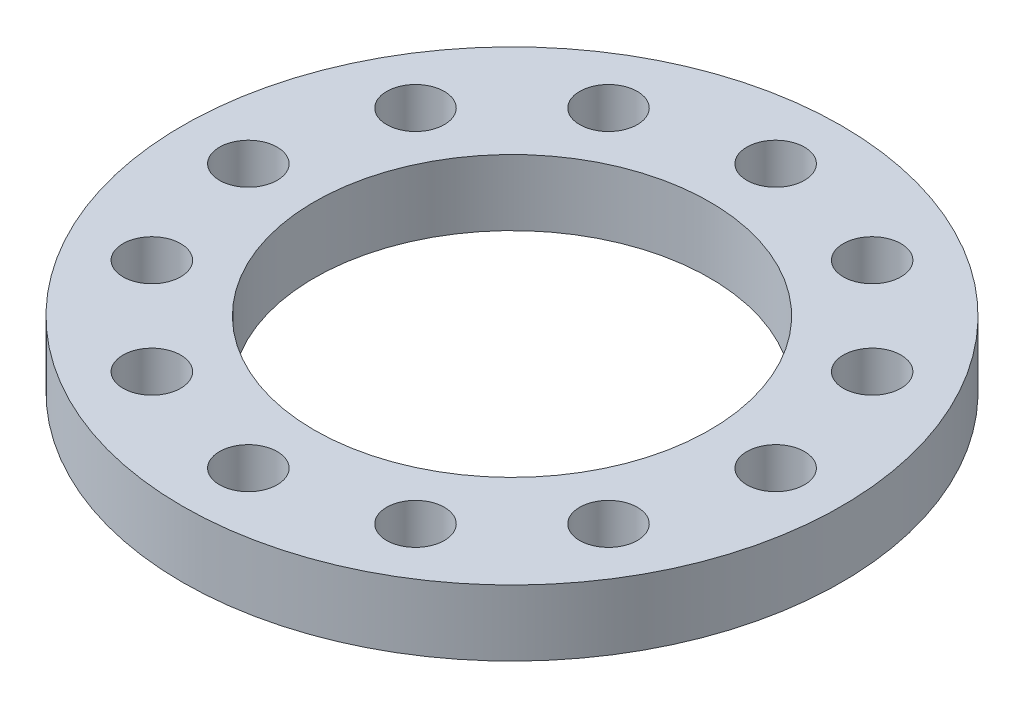
ISO-10303-21;
HEADER;
FILE_DESCRIPTION(('STEP AP214'),'2;1');
FILE_NAME('part.step','',(''),(''),'','','');
FILE_SCHEMA(('AUTOMOTIVE_DESIGN { 1 0 10303 214 1 1 1 1 }'));
ENDSEC;
DATA;
#1=APPLICATION_CONTEXT('core data for automotive mechanical design processes');
#2=APPLICATION_PROTOCOL_DEFINITION('international standard','automotive_design',2000,#1);
#3=PRODUCT_CONTEXT('',#1,'mechanical');
#4=PRODUCT('Part','Part','',(#3));
#5=PRODUCT_RELATED_PRODUCT_CATEGORY('part','',(#4));
#6=PRODUCT_DEFINITION_FORMATION('','',#4);
#7=PRODUCT_DEFINITION_CONTEXT('part definition',#1,'design');
#8=PRODUCT_DEFINITION('design','',#6,#7);
#9=PRODUCT_DEFINITION_SHAPE('','',#8);
#10=(LENGTH_UNIT() NAMED_UNIT(*) SI_UNIT(.MILLI.,.METRE.));
#11=(NAMED_UNIT(*) PLANE_ANGLE_UNIT() SI_UNIT($,.RADIAN.));
#12=(NAMED_UNIT(*) SI_UNIT($,.STERADIAN.) SOLID_ANGLE_UNIT());
#13=UNCERTAINTY_MEASURE_WITH_UNIT(LENGTH_MEASURE(1.E-05),#10,'distance_accuracy_value','');
#14=(GEOMETRIC_REPRESENTATION_CONTEXT(3) GLOBAL_UNCERTAINTY_ASSIGNED_CONTEXT((#13)) GLOBAL_UNIT_ASSIGNED_CONTEXT((#10,
#11,#12)) REPRESENTATION_CONTEXT('',''));
#15=CARTESIAN_POINT('',(0.,0.,0.));
#16=DIRECTION('',(0.,0.,1.));
#17=DIRECTION('',(1.,0.,0.));
#18=AXIS2_PLACEMENT_3D('',#15,#16,#17);
#19=CARTESIAN_POINT('',(0.,4.,0.));
#20=DIRECTION('',(0.,-1.,0.));
#21=DIRECTION('',(0.,0.,-1.));
#22=AXIS2_PLACEMENT_3D('',#19,#20,#21);
#23=CYLINDRICAL_SURFACE('',#22,12.);
#24=CARTESIAN_POINT('',(0.,4.,0.));
#25=DIRECTION('',(0.,1.,0.));
#26=DIRECTION('',(0.,0.,1.));
#27=AXIS2_PLACEMENT_3D('',#24,#25,#26);
#28=CIRCLE('',#27,12.);
#29=CARTESIAN_POINT('',(0.,4.,12.));
#30=VERTEX_POINT('',#29);
#31=EDGE_CURVE('E52',#30,#30,#28,.T.);
#32=ORIENTED_EDGE('',*,*,#31,.T.);
#33=EDGE_LOOP('',(#32));
#34=FACE_BOUND('',#33,.T.);
#35=CARTESIAN_POINT('',(0.,0.,0.));
#36=DIRECTION('',(0.,1.,0.));
#37=DIRECTION('',(0.,0.,1.));
#38=AXIS2_PLACEMENT_3D('',#35,#36,#37);
#39=CIRCLE('',#38,12.);
#40=CARTESIAN_POINT('',(0.,0.,12.));
#41=VERTEX_POINT('',#40);
#42=EDGE_CURVE('E109',#41,#41,#39,.T.);
#43=ORIENTED_EDGE('',*,*,#42,.F.);
#44=EDGE_LOOP('',(#43));
#45=FACE_BOUND('',#44,.T.);
#46=ADVANCED_FACE('F43',(#34,#45),#23,.F.);
#47=CARTESIAN_POINT('',(-8.00000000000007,4.,-13.856406460551));
#48=DIRECTION('',(0.,-1.,0.));
#49=DIRECTION('',(0.,0.,-1.));
#50=AXIS2_PLACEMENT_3D('',#47,#48,#49);
#51=CYLINDRICAL_SURFACE('',#50,1.75);
#52=CARTESIAN_POINT('',(-8.00000000000007,4.,-13.856406460551));
#53=DIRECTION('',(0.,1.,0.));
#54=DIRECTION('',(0.,0.,1.));
#55=AXIS2_PLACEMENT_3D('',#52,#53,#54);
#56=CIRCLE('',#55,1.75);
#57=CARTESIAN_POINT('',(-8.00000000000007,4.,-12.106406460551));
#58=VERTEX_POINT('',#57);
#59=EDGE_CURVE('E58',#58,#58,#56,.T.);
#60=ORIENTED_EDGE('',*,*,#59,.T.);
#61=EDGE_LOOP('',(#60));
#62=FACE_BOUND('',#61,.T.);
#63=CARTESIAN_POINT('',(-8.00000000000007,0.,-13.856406460551));
#64=DIRECTION('',(0.,1.,0.));
#65=DIRECTION('',(0.,0.,1.));
#66=AXIS2_PLACEMENT_3D('',#63,#64,#65);
#67=CIRCLE('',#66,1.75);
#68=CARTESIAN_POINT('',(-8.00000000000007,0.,-12.106406460551));
#69=VERTEX_POINT('',#68);
#70=EDGE_CURVE('E106',#69,#69,#67,.T.);
#71=ORIENTED_EDGE('',*,*,#70,.F.);
#72=EDGE_LOOP('',(#71));
#73=FACE_BOUND('',#72,.T.);
#74=ADVANCED_FACE('F168',(#62,#73),#51,.F.);
#75=CARTESIAN_POINT('',(-13.8564064605511,4.,-7.99999999999991));
#76=DIRECTION('',(0.,-1.,0.));
#77=DIRECTION('',(0.,0.,-1.));
#78=AXIS2_PLACEMENT_3D('',#75,#76,#77);
#79=CYLINDRICAL_SURFACE('',#78,1.75);
#80=CARTESIAN_POINT('',(-13.8564064605511,4.,-7.99999999999991));
#81=DIRECTION('',(0.,1.,0.));
#82=DIRECTION('',(0.,0.,1.));
#83=AXIS2_PLACEMENT_3D('',#80,#81,#82);
#84=CIRCLE('',#83,1.75);
#85=CARTESIAN_POINT('',(-13.8564064605511,4.,-6.24999999999992));
#86=VERTEX_POINT('',#85);
#87=EDGE_CURVE('E161',#86,#86,#84,.T.);
#88=ORIENTED_EDGE('',*,*,#87,.T.);
#89=EDGE_LOOP('',(#88));
#90=FACE_BOUND('',#89,.T.);
#91=CARTESIAN_POINT('',(-13.8564064605511,0.,-7.99999999999991));
#92=DIRECTION('',(0.,1.,0.));
#93=DIRECTION('',(0.,0.,1.));
#94=AXIS2_PLACEMENT_3D('',#91,#92,#93);
#95=CIRCLE('',#94,1.75);
#96=CARTESIAN_POINT('',(-13.8564064605511,0.,-6.24999999999992));
#97=VERTEX_POINT('',#96);
#98=EDGE_CURVE('E102',#97,#97,#95,.T.);
#99=ORIENTED_EDGE('',*,*,#98,.F.);
#100=EDGE_LOOP('',(#99));
#101=FACE_BOUND('',#100,.T.);
#102=ADVANCED_FACE('F186',(#90,#101),#79,.F.);
#103=CARTESIAN_POINT('',(-16.,4.,0.));
#104=DIRECTION('',(0.,-1.,0.));
#105=DIRECTION('',(0.,0.,-1.));
#106=AXIS2_PLACEMENT_3D('',#103,#104,#105);
#107=CYLINDRICAL_SURFACE('',#106,1.75);
#108=CARTESIAN_POINT('',(-16.,4.,0.));
#109=DIRECTION('',(0.,1.,0.));
#110=DIRECTION('',(0.,0.,1.));
#111=AXIS2_PLACEMENT_3D('',#108,#109,#110);
#112=CIRCLE('',#111,1.75);
#113=CARTESIAN_POINT('',(-16.,4.,1.75));
#114=VERTEX_POINT('',#113);
#115=EDGE_CURVE('E157',#114,#114,#112,.T.);
#116=ORIENTED_EDGE('',*,*,#115,.T.);
#117=EDGE_LOOP('',(#116));
#118=FACE_BOUND('',#117,.T.);
#119=CARTESIAN_POINT('',(-16.,0.,0.));
#120=DIRECTION('',(0.,1.,0.));
#121=DIRECTION('',(0.,0.,1.));
#122=AXIS2_PLACEMENT_3D('',#119,#120,#121);
#123=CIRCLE('',#122,1.75);
#124=CARTESIAN_POINT('',(-16.,0.,1.75));
#125=VERTEX_POINT('',#124);
#126=EDGE_CURVE('E98',#125,#125,#123,.T.);
#127=ORIENTED_EDGE('',*,*,#126,.F.);
#128=EDGE_LOOP('',(#127));
#129=FACE_BOUND('',#128,.T.);
#130=ADVANCED_FACE('F193',(#118,#129),#107,.F.);
#131=CARTESIAN_POINT('',(-13.8564064605511,4.,7.99999999999992));
#132=DIRECTION('',(0.,-1.,0.));
#133=DIRECTION('',(0.,0.,-1.));
#134=AXIS2_PLACEMENT_3D('',#131,#132,#133);
#135=CYLINDRICAL_SURFACE('',#134,1.75);
#136=CARTESIAN_POINT('',(-13.8564064605511,4.,7.99999999999992));
#137=DIRECTION('',(0.,1.,0.));
#138=DIRECTION('',(0.,0.,1.));
#139=AXIS2_PLACEMENT_3D('',#136,#137,#138);
#140=CIRCLE('',#139,1.75);
#141=CARTESIAN_POINT('',(-13.8564064605511,4.,9.74999999999992));
#142=VERTEX_POINT('',#141);
#143=EDGE_CURVE('E153',#142,#142,#140,.T.);
#144=ORIENTED_EDGE('',*,*,#143,.T.);
#145=EDGE_LOOP('',(#144));
#146=FACE_BOUND('',#145,.T.);
#147=CARTESIAN_POINT('',(-13.8564064605511,0.,7.99999999999992));
#148=DIRECTION('',(0.,1.,0.));
#149=DIRECTION('',(0.,0.,1.));
#150=AXIS2_PLACEMENT_3D('',#147,#148,#149);
#151=CIRCLE('',#150,1.75);
#152=CARTESIAN_POINT('',(-13.8564064605511,0.,9.74999999999992));
#153=VERTEX_POINT('',#152);
#154=EDGE_CURVE('E94',#153,#153,#151,.T.);
#155=ORIENTED_EDGE('',*,*,#154,.F.);
#156=EDGE_LOOP('',(#155));
#157=FACE_BOUND('',#156,.T.);
#158=ADVANCED_FACE('F197',(#146,#157),#135,.F.);
#159=CARTESIAN_POINT('',(-8.00000000000007,4.,13.856406460551));
#160=DIRECTION('',(0.,-1.,0.));
#161=DIRECTION('',(0.,0.,-1.));
#162=AXIS2_PLACEMENT_3D('',#159,#160,#161);
#163=CYLINDRICAL_SURFACE('',#162,1.75);
#164=CARTESIAN_POINT('',(-8.00000000000007,4.,13.856406460551));
#165=DIRECTION('',(0.,1.,0.));
#166=DIRECTION('',(0.,0.,1.));
#167=AXIS2_PLACEMENT_3D('',#164,#165,#166);
#168=CIRCLE('',#167,1.75);
#169=CARTESIAN_POINT('',(-8.00000000000007,4.,15.606406460551));
#170=VERTEX_POINT('',#169);
#171=EDGE_CURVE('E149',#170,#170,#168,.T.);
#172=ORIENTED_EDGE('',*,*,#171,.T.);
#173=EDGE_LOOP('',(#172));
#174=FACE_BOUND('',#173,.T.);
#175=CARTESIAN_POINT('',(-8.00000000000007,0.,13.856406460551));
#176=DIRECTION('',(0.,1.,0.));
#177=DIRECTION('',(0.,0.,1.));
#178=AXIS2_PLACEMENT_3D('',#175,#176,#177);
#179=CIRCLE('',#178,1.75);
#180=CARTESIAN_POINT('',(-8.00000000000007,0.,15.606406460551));
#181=VERTEX_POINT('',#180);
#182=EDGE_CURVE('E90',#181,#181,#179,.T.);
#183=ORIENTED_EDGE('',*,*,#182,.F.);
#184=EDGE_LOOP('',(#183));
#185=FACE_BOUND('',#184,.T.);
#186=ADVANCED_FACE('F201',(#174,#185),#163,.F.);
#187=CARTESIAN_POINT('',(7.99999999999997,4.,13.856406460551));
#188=DIRECTION('',(0.,-1.,0.));
#189=DIRECTION('',(0.,0.,-1.));
#190=AXIS2_PLACEMENT_3D('',#187,#188,#189);
#191=CYLINDRICAL_SURFACE('',#190,1.75);
#192=CARTESIAN_POINT('',(7.99999999999997,4.,13.856406460551));
#193=DIRECTION('',(0.,1.,0.));
#194=DIRECTION('',(0.,0.,1.));
#195=AXIS2_PLACEMENT_3D('',#192,#193,#194);
#196=CIRCLE('',#195,1.75);
#197=CARTESIAN_POINT('',(7.99999999999997,4.,15.606406460551));
#198=VERTEX_POINT('',#197);
#199=EDGE_CURVE('E145',#198,#198,#196,.T.);
#200=ORIENTED_EDGE('',*,*,#199,.T.);
#201=EDGE_LOOP('',(#200));
#202=FACE_BOUND('',#201,.T.);
#203=CARTESIAN_POINT('',(7.99999999999997,0.,13.856406460551));
#204=DIRECTION('',(0.,1.,0.));
#205=DIRECTION('',(0.,0.,1.));
#206=AXIS2_PLACEMENT_3D('',#203,#204,#205);
#207=CIRCLE('',#206,1.75);
#208=CARTESIAN_POINT('',(7.99999999999997,0.,15.606406460551));
#209=VERTEX_POINT('',#208);
#210=EDGE_CURVE('E86',#209,#209,#207,.T.);
#211=ORIENTED_EDGE('',*,*,#210,.F.);
#212=EDGE_LOOP('',(#211));
#213=FACE_BOUND('',#212,.T.);
#214=ADVANCED_FACE('F205',(#202,#213),#191,.F.);
#215=CARTESIAN_POINT('',(0.,4.,16.));
#216=DIRECTION('',(0.,-1.,0.));
#217=DIRECTION('',(0.,0.,-1.));
#218=AXIS2_PLACEMENT_3D('',#215,#216,#217);
#219=CYLINDRICAL_SURFACE('',#218,1.75);
#220=CARTESIAN_POINT('',(0.,4.,16.));
#221=DIRECTION('',(0.,1.,0.));
#222=DIRECTION('',(0.,0.,1.));
#223=AXIS2_PLACEMENT_3D('',#220,#221,#222);
#224=CIRCLE('',#223,1.75);
#225=CARTESIAN_POINT('',(0.,4.,17.75));
#226=VERTEX_POINT('',#225);
#227=EDGE_CURVE('E141',#226,#226,#224,.T.);
#228=ORIENTED_EDGE('',*,*,#227,.T.);
#229=EDGE_LOOP('',(#228));
#230=FACE_BOUND('',#229,.T.);
#231=CARTESIAN_POINT('',(0.,0.,16.));
#232=DIRECTION('',(0.,1.,0.));
#233=DIRECTION('',(0.,0.,1.));
#234=AXIS2_PLACEMENT_3D('',#231,#232,#233);
#235=CIRCLE('',#234,1.75);
#236=CARTESIAN_POINT('',(0.,0.,17.75));
#237=VERTEX_POINT('',#236);
#238=EDGE_CURVE('E82',#237,#237,#235,.T.);
#239=ORIENTED_EDGE('',*,*,#238,.F.);
#240=EDGE_LOOP('',(#239));
#241=FACE_BOUND('',#240,.T.);
#242=ADVANCED_FACE('F209',(#230,#241),#219,.F.);
#243=CARTESIAN_POINT('',(13.856406460551,4.,8.00000000000002));
#244=DIRECTION('',(0.,-1.,0.));
#245=DIRECTION('',(0.,0.,-1.));
#246=AXIS2_PLACEMENT_3D('',#243,#244,#245);
#247=CYLINDRICAL_SURFACE('',#246,1.75);
#248=CARTESIAN_POINT('',(13.856406460551,4.,8.00000000000002));
#249=DIRECTION('',(0.,1.,0.));
#250=DIRECTION('',(0.,0.,1.));
#251=AXIS2_PLACEMENT_3D('',#248,#249,#250);
#252=CIRCLE('',#251,1.75);
#253=CARTESIAN_POINT('',(13.856406460551,4.,9.75000000000002));
#254=VERTEX_POINT('',#253);
#255=EDGE_CURVE('E137',#254,#254,#252,.T.);
#256=ORIENTED_EDGE('',*,*,#255,.T.);
#257=EDGE_LOOP('',(#256));
#258=FACE_BOUND('',#257,.T.);
#259=CARTESIAN_POINT('',(13.856406460551,0.,8.00000000000002));
#260=DIRECTION('',(0.,1.,0.));
#261=DIRECTION('',(0.,0.,1.));
#262=AXIS2_PLACEMENT_3D('',#259,#260,#261);
#263=CIRCLE('',#262,1.75);
#264=CARTESIAN_POINT('',(13.856406460551,0.,9.75000000000002));
#265=VERTEX_POINT('',#264);
#266=EDGE_CURVE('E78',#265,#265,#263,.T.);
#267=ORIENTED_EDGE('',*,*,#266,.F.);
#268=EDGE_LOOP('',(#267));
#269=FACE_BOUND('',#268,.T.);
#270=ADVANCED_FACE('F213',(#258,#269),#247,.F.);
#271=CARTESIAN_POINT('',(16.,4.,0.));
#272=DIRECTION('',(0.,-1.,0.));
#273=DIRECTION('',(0.,0.,-1.));
#274=AXIS2_PLACEMENT_3D('',#271,#272,#273);
#275=CYLINDRICAL_SURFACE('',#274,1.75);
#276=CARTESIAN_POINT('',(16.,4.,0.));
#277=DIRECTION('',(0.,1.,0.));
#278=DIRECTION('',(0.,0.,1.));
#279=AXIS2_PLACEMENT_3D('',#276,#277,#278);
#280=CIRCLE('',#279,1.75);
#281=CARTESIAN_POINT('',(16.,4.,1.75));
#282=VERTEX_POINT('',#281);
#283=EDGE_CURVE('E133',#282,#282,#280,.T.);
#284=ORIENTED_EDGE('',*,*,#283,.T.);
#285=EDGE_LOOP('',(#284));
#286=FACE_BOUND('',#285,.T.);
#287=CARTESIAN_POINT('',(16.,0.,0.));
#288=DIRECTION('',(0.,1.,0.));
#289=DIRECTION('',(0.,0.,1.));
#290=AXIS2_PLACEMENT_3D('',#287,#288,#289);
#291=CIRCLE('',#290,1.75);
#292=CARTESIAN_POINT('',(16.,0.,1.75));
#293=VERTEX_POINT('',#292);
#294=EDGE_CURVE('E74',#293,#293,#291,.T.);
#295=ORIENTED_EDGE('',*,*,#294,.F.);
#296=EDGE_LOOP('',(#295));
#297=FACE_BOUND('',#296,.T.);
#298=ADVANCED_FACE('F217',(#286,#297),#275,.F.);
#299=CARTESIAN_POINT('',(13.856406460551,4.,-8.00000000000002));
#300=DIRECTION('',(0.,-1.,0.));
#301=DIRECTION('',(0.,0.,-1.));
#302=AXIS2_PLACEMENT_3D('',#299,#300,#301);
#303=CYLINDRICAL_SURFACE('',#302,1.75);
#304=CARTESIAN_POINT('',(13.856406460551,4.,-8.00000000000002));
#305=DIRECTION('',(0.,1.,0.));
#306=DIRECTION('',(0.,0.,1.));
#307=AXIS2_PLACEMENT_3D('',#304,#305,#306);
#308=CIRCLE('',#307,1.75);
#309=CARTESIAN_POINT('',(13.856406460551,4.,-6.25000000000002));
#310=VERTEX_POINT('',#309);
#311=EDGE_CURVE('E127',#310,#310,#308,.T.);
#312=ORIENTED_EDGE('',*,*,#311,.T.);
#313=EDGE_LOOP('',(#312));
#314=FACE_BOUND('',#313,.T.);
#315=CARTESIAN_POINT('',(13.856406460551,0.,-8.00000000000002));
#316=DIRECTION('',(0.,1.,0.));
#317=DIRECTION('',(0.,0.,1.));
#318=AXIS2_PLACEMENT_3D('',#315,#316,#317);
#319=CIRCLE('',#318,1.75);
#320=CARTESIAN_POINT('',(13.856406460551,0.,-6.25000000000002));
#321=VERTEX_POINT('',#320);
#322=EDGE_CURVE('E70',#321,#321,#319,.T.);
#323=ORIENTED_EDGE('',*,*,#322,.F.);
#324=EDGE_LOOP('',(#323));
#325=FACE_BOUND('',#324,.T.);
#326=ADVANCED_FACE('F221',(#314,#325),#303,.F.);
#327=CARTESIAN_POINT('',(7.99999999999997,4.,-13.856406460551));
#328=DIRECTION('',(0.,-1.,0.));
#329=DIRECTION('',(0.,0.,-1.));
#330=AXIS2_PLACEMENT_3D('',#327,#328,#329);
#331=CYLINDRICAL_SURFACE('',#330,1.75);
#332=CARTESIAN_POINT('',(7.99999999999997,4.,-13.856406460551));
#333=DIRECTION('',(0.,1.,0.));
#334=DIRECTION('',(0.,0.,1.));
#335=AXIS2_PLACEMENT_3D('',#332,#333,#334);
#336=CIRCLE('',#335,1.75);
#337=CARTESIAN_POINT('',(7.99999999999997,4.,-12.106406460551));
#338=VERTEX_POINT('',#337);
#339=EDGE_CURVE('E121',#338,#338,#336,.T.);
#340=ORIENTED_EDGE('',*,*,#339,.T.);
#341=EDGE_LOOP('',(#340));
#342=FACE_BOUND('',#341,.T.);
#343=CARTESIAN_POINT('',(7.99999999999997,0.,-13.856406460551));
#344=DIRECTION('',(0.,1.,0.));
#345=DIRECTION('',(0.,0.,1.));
#346=AXIS2_PLACEMENT_3D('',#343,#344,#345);
#347=CIRCLE('',#346,1.75);
#348=CARTESIAN_POINT('',(7.99999999999997,0.,-12.106406460551));
#349=VERTEX_POINT('',#348);
#350=EDGE_CURVE('E66',#349,#349,#347,.T.);
#351=ORIENTED_EDGE('',*,*,#350,.F.);
#352=EDGE_LOOP('',(#351));
#353=FACE_BOUND('',#352,.T.);
#354=ADVANCED_FACE('F224',(#342,#353),#331,.F.);
#355=CARTESIAN_POINT('',(0.,4.,-16.));
#356=DIRECTION('',(0.,-1.,0.));
#357=DIRECTION('',(0.,0.,-1.));
#358=AXIS2_PLACEMENT_3D('',#355,#356,#357);
#359=CYLINDRICAL_SURFACE('',#358,1.75);
#360=CARTESIAN_POINT('',(0.,4.,-16.));
#361=DIRECTION('',(0.,1.,0.));
#362=DIRECTION('',(0.,0.,1.));
#363=AXIS2_PLACEMENT_3D('',#360,#361,#362);
#364=CIRCLE('',#363,1.75);
#365=CARTESIAN_POINT('',(0.,4.,-14.25));
#366=VERTEX_POINT('',#365);
#367=EDGE_CURVE('E116',#366,#366,#364,.T.);
#368=ORIENTED_EDGE('',*,*,#367,.T.);
#369=EDGE_LOOP('',(#368));
#370=FACE_BOUND('',#369,.T.);
#371=CARTESIAN_POINT('',(0.,0.,-16.));
#372=DIRECTION('',(0.,1.,0.));
#373=DIRECTION('',(0.,0.,1.));
#374=AXIS2_PLACEMENT_3D('',#371,#372,#373);
#375=CIRCLE('',#374,1.75);
#376=CARTESIAN_POINT('',(0.,0.,-14.25));
#377=VERTEX_POINT('',#376);
#378=EDGE_CURVE('E62',#377,#377,#375,.T.);
#379=ORIENTED_EDGE('',*,*,#378,.F.);
#380=EDGE_LOOP('',(#379));
#381=FACE_BOUND('',#380,.T.);
#382=ADVANCED_FACE('F45',(#370,#381),#359,.F.);
#383=CARTESIAN_POINT('',(0.,4.,0.));
#384=DIRECTION('',(0.,-1.,0.));
#385=DIRECTION('',(0.,0.,-1.));
#386=AXIS2_PLACEMENT_3D('',#383,#384,#385);
#387=CYLINDRICAL_SURFACE('',#386,20.);
#388=CARTESIAN_POINT('',(0.,4.,0.));
#389=DIRECTION('',(0.,1.,0.));
#390=DIRECTION('',(0.,0.,1.));
#391=AXIS2_PLACEMENT_3D('',#388,#389,#390);
#392=CIRCLE('',#391,20.);
#393=CARTESIAN_POINT('',(0.,4.,20.));
#394=VERTEX_POINT('',#393);
#395=EDGE_CURVE('E10',#394,#394,#392,.T.);
#396=ORIENTED_EDGE('',*,*,#395,.F.);
#397=EDGE_LOOP('',(#396));
#398=FACE_BOUND('',#397,.T.);
#399=CARTESIAN_POINT('',(0.,0.,0.));
#400=DIRECTION('',(0.,1.,0.));
#401=DIRECTION('',(0.,0.,1.));
#402=AXIS2_PLACEMENT_3D('',#399,#400,#401);
#403=CIRCLE('',#402,20.);
#404=CARTESIAN_POINT('',(0.,0.,20.));
#405=VERTEX_POINT('',#404);
#406=EDGE_CURVE('E47',#405,#405,#403,.T.);
#407=ORIENTED_EDGE('',*,*,#406,.T.);
#408=EDGE_LOOP('',(#407));
#409=FACE_BOUND('',#408,.T.);
#410=ADVANCED_FACE('F175',(#398,#409),#387,.T.);
#411=CARTESIAN_POINT('',(0.,4.,0.));
#412=DIRECTION('',(0.,1.,0.));
#413=DIRECTION('',(0.,0.,1.));
#414=AXIS2_PLACEMENT_3D('',#411,#412,#413);
#415=PLANE('',#414);
#416=ORIENTED_EDGE('',*,*,#367,.F.);
#417=EDGE_LOOP('',(#416));
#418=FACE_BOUND('',#417,.T.);
#419=ORIENTED_EDGE('',*,*,#339,.F.);
#420=EDGE_LOOP('',(#419));
#421=FACE_BOUND('',#420,.T.);
#422=ORIENTED_EDGE('',*,*,#311,.F.);
#423=EDGE_LOOP('',(#422));
#424=FACE_BOUND('',#423,.T.);
#425=ORIENTED_EDGE('',*,*,#283,.F.);
#426=EDGE_LOOP('',(#425));
#427=FACE_BOUND('',#426,.T.);
#428=ORIENTED_EDGE('',*,*,#255,.F.);
#429=EDGE_LOOP('',(#428));
#430=FACE_BOUND('',#429,.T.);
#431=ORIENTED_EDGE('',*,*,#227,.F.);
#432=EDGE_LOOP('',(#431));
#433=FACE_BOUND('',#432,.T.);
#434=ORIENTED_EDGE('',*,*,#199,.F.);
#435=EDGE_LOOP('',(#434));
#436=FACE_BOUND('',#435,.T.);
#437=ORIENTED_EDGE('',*,*,#171,.F.);
#438=EDGE_LOOP('',(#437));
#439=FACE_BOUND('',#438,.T.);
#440=ORIENTED_EDGE('',*,*,#143,.F.);
#441=EDGE_LOOP('',(#440));
#442=FACE_BOUND('',#441,.T.);
#443=ORIENTED_EDGE('',*,*,#115,.F.);
#444=EDGE_LOOP('',(#443));
#445=FACE_BOUND('',#444,.T.);
#446=ORIENTED_EDGE('',*,*,#87,.F.);
#447=EDGE_LOOP('',(#446));
#448=FACE_BOUND('',#447,.T.);
#449=ORIENTED_EDGE('',*,*,#59,.F.);
#450=EDGE_LOOP('',(#449));
#451=FACE_BOUND('',#450,.T.);
#452=ORIENTED_EDGE('',*,*,#31,.F.);
#453=EDGE_LOOP('',(#452));
#454=FACE_BOUND('',#453,.T.);
#455=ORIENTED_EDGE('',*,*,#395,.T.);
#456=EDGE_LOOP('',(#455));
#457=FACE_BOUND('',#456,.T.);
#458=ADVANCED_FACE('F171',(#418,#421,#424,#427,#430,#433,#436,#439,#442,#445,#448,#451,#454,
#457),#415,.T.);
#459=CARTESIAN_POINT('',(0.,0.,0.));
#460=DIRECTION('',(0.,1.,0.));
#461=DIRECTION('',(0.,0.,1.));
#462=AXIS2_PLACEMENT_3D('',#459,#460,#461);
#463=PLANE('',#462);
#464=ORIENTED_EDGE('',*,*,#378,.T.);
#465=EDGE_LOOP('',(#464));
#466=FACE_BOUND('',#465,.T.);
#467=ORIENTED_EDGE('',*,*,#350,.T.);
#468=EDGE_LOOP('',(#467));
#469=FACE_BOUND('',#468,.T.);
#470=ORIENTED_EDGE('',*,*,#322,.T.);
#471=EDGE_LOOP('',(#470));
#472=FACE_BOUND('',#471,.T.);
#473=ORIENTED_EDGE('',*,*,#294,.T.);
#474=EDGE_LOOP('',(#473));
#475=FACE_BOUND('',#474,.T.);
#476=ORIENTED_EDGE('',*,*,#266,.T.);
#477=EDGE_LOOP('',(#476));
#478=FACE_BOUND('',#477,.T.);
#479=ORIENTED_EDGE('',*,*,#238,.T.);
#480=EDGE_LOOP('',(#479));
#481=FACE_BOUND('',#480,.T.);
#482=ORIENTED_EDGE('',*,*,#210,.T.);
#483=EDGE_LOOP('',(#482));
#484=FACE_BOUND('',#483,.T.);
#485=ORIENTED_EDGE('',*,*,#182,.T.);
#486=EDGE_LOOP('',(#485));
#487=FACE_BOUND('',#486,.T.);
#488=ORIENTED_EDGE('',*,*,#154,.T.);
#489=EDGE_LOOP('',(#488));
#490=FACE_BOUND('',#489,.T.);
#491=ORIENTED_EDGE('',*,*,#126,.T.);
#492=EDGE_LOOP('',(#491));
#493=FACE_BOUND('',#492,.T.);
#494=ORIENTED_EDGE('',*,*,#98,.T.);
#495=EDGE_LOOP('',(#494));
#496=FACE_BOUND('',#495,.T.);
#497=ORIENTED_EDGE('',*,*,#70,.T.);
#498=EDGE_LOOP('',(#497));
#499=FACE_BOUND('',#498,.T.);
#500=ORIENTED_EDGE('',*,*,#42,.T.);
#501=EDGE_LOOP('',(#500));
#502=FACE_BOUND('',#501,.T.);
#503=ORIENTED_EDGE('',*,*,#406,.F.);
#504=EDGE_LOOP('',(#503));
#505=FACE_BOUND('',#504,.T.);
#506=ADVANCED_FACE('F174',(#466,#469,#472,#475,#478,#481,#484,#487,#490,#493,#496,#499,#502,
#505),#463,.F.);
#507=CLOSED_SHELL('',(#46,#74,#102,#130,#158,#186,#214,#242,#270,#298,#326,#354,#382,#410,#458,#506));
#508=MANIFOLD_SOLID_BREP('B2',#507);
#509=ADVANCED_BREP_SHAPE_REPRESENTATION('',(#18,#508),#14);
#510=SHAPE_DEFINITION_REPRESENTATION(#9,#509);
ENDSEC;
END-ISO-10303-21;
